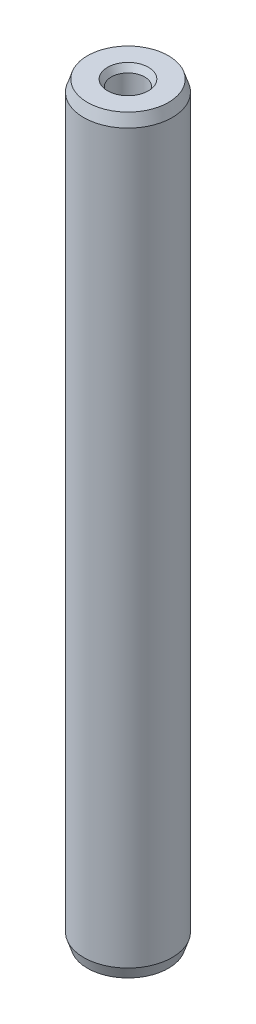
ISO-10303-21;
HEADER;
FILE_DESCRIPTION(('STEP AP214'),'2;1');
FILE_NAME('part.step','',(''),(''),'','','');
FILE_SCHEMA(('AUTOMOTIVE_DESIGN { 1 0 10303 214 1 1 1 1 }'));
ENDSEC;
DATA;
#1=APPLICATION_CONTEXT('core data for automotive mechanical design processes');
#2=APPLICATION_PROTOCOL_DEFINITION('international standard','automotive_design',2000,#1);
#3=PRODUCT_CONTEXT('',#1,'mechanical');
#4=PRODUCT('Part','Part','',(#3));
#5=PRODUCT_RELATED_PRODUCT_CATEGORY('part','',(#4));
#6=PRODUCT_DEFINITION_FORMATION('','',#4);
#7=PRODUCT_DEFINITION_CONTEXT('part definition',#1,'design');
#8=PRODUCT_DEFINITION('design','',#6,#7);
#9=PRODUCT_DEFINITION_SHAPE('','',#8);
#10=(LENGTH_UNIT() NAMED_UNIT(*) SI_UNIT(.MILLI.,.METRE.));
#11=(NAMED_UNIT(*) PLANE_ANGLE_UNIT() SI_UNIT($,.RADIAN.));
#12=(NAMED_UNIT(*) SI_UNIT($,.STERADIAN.) SOLID_ANGLE_UNIT());
#13=UNCERTAINTY_MEASURE_WITH_UNIT(LENGTH_MEASURE(1.E-05),#10,'distance_accuracy_value','');
#14=(GEOMETRIC_REPRESENTATION_CONTEXT(3) GLOBAL_UNCERTAINTY_ASSIGNED_CONTEXT((#13)) GLOBAL_UNIT_ASSIGNED_CONTEXT((#10,
#11,#12)) REPRESENTATION_CONTEXT('',''));
#15=CARTESIAN_POINT('',(0.,0.,0.));
#16=DIRECTION('',(0.,0.,1.));
#17=DIRECTION('',(1.,0.,0.));
#18=AXIS2_PLACEMENT_3D('',#15,#16,#17);
#19=CARTESIAN_POINT('',(-1.0659227422867,-22.9140630693795,-1.12643595849704));
#20=DIRECTION('',(0.,1.,0.));
#21=DIRECTION('',(0.,0.,1.));
#22=AXIS2_PLACEMENT_3D('',#19,#20,#21);
#23=CYLINDRICAL_SURFACE('',#22,1.1303);
#24=CARTESIAN_POINT('',(-1.0659227422867,-17.1990630693591,-1.12643595849704));
#25=DIRECTION('',(0.,1.,0.));
#26=DIRECTION('',(0.,0.,1.));
#27=AXIS2_PLACEMENT_3D('',#24,#25,#26);
#28=CIRCLE('',#27,1.1303);
#29=CARTESIAN_POINT('',(-1.0659227422867,-17.1990630693591,0.00386404150295831));
#30=VERTEX_POINT('',#29);
#31=EDGE_CURVE('E11',#30,#30,#28,.T.);
#32=ORIENTED_EDGE('',*,*,#31,.T.);
#33=EDGE_LOOP('',(#32));
#34=FACE_BOUND('',#33,.T.);
#35=CARTESIAN_POINT('',(-1.0659227422867,-22.4741221642265,-1.12643595849704));
#36=DIRECTION('',(0.,1.,0.));
#37=DIRECTION('',(0.,0.,1.));
#38=AXIS2_PLACEMENT_3D('',#35,#36,#37);
#39=CIRCLE('',#38,1.1303);
#40=CARTESIAN_POINT('',(-1.0659227422867,-22.4741221642265,0.00386404150295831));
#41=VERTEX_POINT('',#40);
#42=EDGE_CURVE('E57',#41,#41,#39,.T.);
#43=ORIENTED_EDGE('',*,*,#42,.F.);
#44=EDGE_LOOP('',(#43));
#45=FACE_BOUND('',#44,.T.);
#46=ADVANCED_FACE('F34',(#34,#45),#23,.F.);
#47=CARTESIAN_POINT('',(-1.0659227422867,-17.1990630693591,-1.12643595849704));
#48=DIRECTION('',(0.,-1.,0.));
#49=DIRECTION('',(0.,0.,-1.));
#50=AXIS2_PLACEMENT_3D('',#47,#48,#49);
#51=CONICAL_SURFACE('',#50,1.1303,1.02974425853617);
#52=CARTESIAN_POINT('',(-1.0659227422867,-16.5199103114562,-1.12643595849704));
#53=VERTEX_POINT('',#52);
#54=VERTEX_LOOP('',#53);
#55=FACE_BOUND('',#54,.T.);
#56=ORIENTED_EDGE('',*,*,#31,.F.);
#57=EDGE_LOOP('',(#56));
#58=FACE_BOUND('',#57,.T.);
#59=ADVANCED_FACE('F47',(#55,#58),#51,.F.);
#60=CARTESIAN_POINT('',(-1.0659227422867,21.4917841728488,-1.12643595849704));
#61=DIRECTION('',(0.,1.,0.));
#62=DIRECTION('',(0.,0.,1.));
#63=AXIS2_PLACEMENT_3D('',#60,#61,#62);
#64=CONICAL_SURFACE('',#63,0.,1.02974425855837);
#65=CARTESIAN_POINT('',(-1.0659227422867,22.1709369307176,-1.12643595849704));
#66=DIRECTION('',(0.,1.,0.));
#67=DIRECTION('',(0.,0.,1.));
#68=AXIS2_PLACEMENT_3D('',#65,#66,#67);
#69=CIRCLE('',#68,1.1303);
#70=CARTESIAN_POINT('',(-1.0659227422867,22.1709369307176,0.00386404150295831));
#71=VERTEX_POINT('',#70);
#72=EDGE_CURVE('E41',#71,#71,#69,.T.);
#73=ORIENTED_EDGE('',*,*,#72,.T.);
#74=EDGE_LOOP('',(#73));
#75=FACE_BOUND('',#74,.T.);
#76=CARTESIAN_POINT('',(-1.0659227422867,21.4917841728488,-1.12643595849704));
#77=VERTEX_POINT('',#76);
#78=VERTEX_LOOP('',#77);
#79=FACE_BOUND('',#78,.T.);
#80=ADVANCED_FACE('F50',(#75,#79),#64,.F.);
#81=CARTESIAN_POINT('',(-1.0659227422867,-22.9140630693795,-1.12643595849704));
#82=DIRECTION('',(0.,1.,0.));
#83=DIRECTION('',(0.,0.,1.));
#84=AXIS2_PLACEMENT_3D('',#81,#82,#83);
#85=CYLINDRICAL_SURFACE('',#84,1.1303);
#86=CARTESIAN_POINT('',(-1.0659227422867,27.4459960255054,-1.12643595849704));
#87=DIRECTION('',(0.,1.,0.));
#88=DIRECTION('',(0.,0.,1.));
#89=AXIS2_PLACEMENT_3D('',#86,#87,#88);
#90=CIRCLE('',#89,1.1303);
#91=CARTESIAN_POINT('',(-1.0659227422867,27.4459960255054,0.00386404150295831));
#92=VERTEX_POINT('',#91);
#93=EDGE_CURVE('E79',#92,#92,#90,.T.);
#94=ORIENTED_EDGE('',*,*,#93,.T.);
#95=EDGE_LOOP('',(#94));
#96=FACE_BOUND('',#95,.T.);
#97=ORIENTED_EDGE('',*,*,#72,.F.);
#98=EDGE_LOOP('',(#97));
#99=FACE_BOUND('',#98,.T.);
#100=ADVANCED_FACE('F85',(#96,#99),#85,.F.);
#101=CARTESIAN_POINT('',(-1.0659227422867,27.4459960255054,-1.12643595849704));
#102=DIRECTION('',(0.,1.,0.));
#103=DIRECTION('',(0.,0.,1.));
#104=AXIS2_PLACEMENT_3D('',#101,#102,#103);
#105=CONICAL_SURFACE('',#104,1.1303,0.523598775485724);
#106=CARTESIAN_POINT('',(-1.0659227422867,27.8859369307156,-1.12643595849704));
#107=DIRECTION('',(0.,1.,0.));
#108=DIRECTION('',(0.,0.,1.));
#109=AXIS2_PLACEMENT_3D('',#106,#107,#108);
#110=CIRCLE('',#109,1.38429999998458);
#111=CARTESIAN_POINT('',(-1.0659227422867,27.8859369307156,0.257864041487543));
#112=VERTEX_POINT('',#111);
#113=EDGE_CURVE('E76',#112,#112,#110,.T.);
#114=ORIENTED_EDGE('',*,*,#113,.T.);
#115=EDGE_LOOP('',(#114));
#116=FACE_BOUND('',#115,.T.);
#117=ORIENTED_EDGE('',*,*,#93,.F.);
#118=EDGE_LOOP('',(#117));
#119=FACE_BOUND('',#118,.T.);
#120=ADVANCED_FACE('F87',(#116,#119),#105,.F.);
#121=CARTESIAN_POINT('',(0.318377257697882,27.8859369307156,-1.12643595849704));
#122=DIRECTION('',(0.,1.,0.));
#123=DIRECTION('',(0.,0.,1.));
#124=AXIS2_PLACEMENT_3D('',#121,#122,#123);
#125=PLANE('',#124);
#126=CARTESIAN_POINT('',(-1.0659227422867,27.8859369307156,-1.12643595849704));
#127=DIRECTION('',(0.,1.,0.));
#128=DIRECTION('',(0.,0.,1.));
#129=AXIS2_PLACEMENT_3D('',#126,#127,#128);
#130=CIRCLE('',#129,2.74320000000416);
#131=CARTESIAN_POINT('',(-1.0659227422867,27.8859369307156,1.61676404150712));
#132=VERTEX_POINT('',#131);
#133=EDGE_CURVE('E73',#132,#132,#130,.T.);
#134=ORIENTED_EDGE('',*,*,#133,.T.);
#135=EDGE_LOOP('',(#134));
#136=FACE_BOUND('',#135,.T.);
#137=ORIENTED_EDGE('',*,*,#113,.F.);
#138=EDGE_LOOP('',(#137));
#139=FACE_BOUND('',#138,.T.);
#140=ADVANCED_FACE('F94',(#136,#139),#125,.T.);
#141=CARTESIAN_POINT('',(-1.0659227422867,27.8859369307156,-1.12643595849704));
#142=DIRECTION('',(0.,-1.,0.));
#143=DIRECTION('',(0.,0.,-1.));
#144=AXIS2_PLACEMENT_3D('',#141,#142,#143);
#145=CONICAL_SURFACE('',#144,2.74320000000416,0.321750554414371);
#146=CARTESIAN_POINT('',(-1.0659227422867,27.1239369307251,-1.12643595849704));
#147=DIRECTION('',(0.,1.,0.));
#148=DIRECTION('',(0.,0.,1.));
#149=AXIS2_PLACEMENT_3D('',#146,#147,#148);
#150=CIRCLE('',#149,2.99720000001602);
#151=CARTESIAN_POINT('',(-1.0659227422867,27.1239369307251,1.87076404151898));
#152=VERTEX_POINT('',#151);
#153=EDGE_CURVE('E70',#152,#152,#150,.T.);
#154=ORIENTED_EDGE('',*,*,#153,.T.);
#155=EDGE_LOOP('',(#154));
#156=FACE_BOUND('',#155,.T.);
#157=ORIENTED_EDGE('',*,*,#133,.F.);
#158=EDGE_LOOP('',(#157));
#159=FACE_BOUND('',#158,.T.);
#160=ADVANCED_FACE('F101',(#156,#159),#145,.T.);
#161=CARTESIAN_POINT('',(-1.0659227422867,-22.9140630693795,-1.12643595849704));
#162=DIRECTION('',(0.,1.,0.));
#163=DIRECTION('',(0.,0.,1.));
#164=AXIS2_PLACEMENT_3D('',#161,#162,#163);
#165=CYLINDRICAL_SURFACE('',#164,2.99720000001602);
#166=CARTESIAN_POINT('',(-1.0659227422867,-22.1520630692749,-1.12643595849704));
#167=DIRECTION('',(0.,1.,0.));
#168=DIRECTION('',(0.,0.,1.));
#169=AXIS2_PLACEMENT_3D('',#166,#167,#168);
#170=CIRCLE('',#169,2.99720000001602);
#171=CARTESIAN_POINT('',(-1.0659227422867,-22.1520630692749,1.87076404151898));
#172=VERTEX_POINT('',#171);
#173=EDGE_CURVE('E67',#172,#172,#170,.T.);
#174=ORIENTED_EDGE('',*,*,#173,.T.);
#175=EDGE_LOOP('',(#174));
#176=FACE_BOUND('',#175,.T.);
#177=ORIENTED_EDGE('',*,*,#153,.F.);
#178=EDGE_LOOP('',(#177));
#179=FACE_BOUND('',#178,.T.);
#180=ADVANCED_FACE('F105',(#176,#179),#165,.T.);
#181=CARTESIAN_POINT('',(-1.0659227422867,-22.1520630692749,-1.12643595849704));
#182=DIRECTION('',(0.,1.,0.));
#183=DIRECTION('',(0.,0.,1.));
#184=AXIS2_PLACEMENT_3D('',#181,#182,#183);
#185=CONICAL_SURFACE('',#184,2.99720000001602,0.321750554414373);
#186=CARTESIAN_POINT('',(-1.0659227422867,-22.9140630693223,-1.12643595849704));
#187=DIRECTION('',(0.,1.,0.));
#188=DIRECTION('',(0.,0.,1.));
#189=AXIS2_PLACEMENT_3D('',#186,#187,#188);
#190=CIRCLE('',#189,2.74319999998521);
#191=CARTESIAN_POINT('',(-1.0659227422867,-22.9140630693223,1.61676404148817));
#192=VERTEX_POINT('',#191);
#193=EDGE_CURVE('E62',#192,#192,#190,.T.);
#194=ORIENTED_EDGE('',*,*,#193,.T.);
#195=EDGE_LOOP('',(#194));
#196=FACE_BOUND('',#195,.T.);
#197=ORIENTED_EDGE('',*,*,#173,.F.);
#198=EDGE_LOOP('',(#197));
#199=FACE_BOUND('',#198,.T.);
#200=ADVANCED_FACE('F109',(#196,#199),#185,.T.);
#201=CARTESIAN_POINT('',(1.67727725769851,-22.9140630693223,-1.12643595849704));
#202=DIRECTION('',(0.,-1.,0.));
#203=DIRECTION('',(0.,0.,-1.));
#204=AXIS2_PLACEMENT_3D('',#201,#202,#203);
#205=PLANE('',#204);
#206=CARTESIAN_POINT('',(-1.0659227422867,-22.9140630693223,-1.12643595849704));
#207=DIRECTION('',(0.,1.,0.));
#208=DIRECTION('',(0.,0.,1.));
#209=AXIS2_PLACEMENT_3D('',#206,#207,#208);
#210=CIRCLE('',#209,1.38429999998458);
#211=CARTESIAN_POINT('',(-1.0659227422867,-22.9140630693223,0.257864041487543));
#212=VERTEX_POINT('',#211);
#213=EDGE_CURVE('E59',#212,#212,#210,.T.);
#214=ORIENTED_EDGE('',*,*,#213,.T.);
#215=EDGE_LOOP('',(#214));
#216=FACE_BOUND('',#215,.T.);
#217=ORIENTED_EDGE('',*,*,#193,.F.);
#218=EDGE_LOOP('',(#217));
#219=FACE_BOUND('',#218,.T.);
#220=ADVANCED_FACE('F113',(#216,#219),#205,.T.);
#221=CARTESIAN_POINT('',(-1.0659227422867,-22.9140630693223,-1.12643595849704));
#222=DIRECTION('',(0.,-1.,0.));
#223=DIRECTION('',(0.,0.,-1.));
#224=AXIS2_PLACEMENT_3D('',#221,#222,#223);
#225=CONICAL_SURFACE('',#224,1.38429999998458,0.5235987755983);
#226=ORIENTED_EDGE('',*,*,#42,.T.);
#227=EDGE_LOOP('',(#226));
#228=FACE_BOUND('',#227,.T.);
#229=ORIENTED_EDGE('',*,*,#213,.F.);
#230=EDGE_LOOP('',(#229));
#231=FACE_BOUND('',#230,.T.);
#232=ADVANCED_FACE('F117',(#228,#231),#225,.F.);
#233=CLOSED_SHELL('',(#46,#59,#80,#100,#120,#140,#160,#180,#200,#220,#232));
#234=MANIFOLD_SOLID_BREP('B2',#233);
#235=ADVANCED_BREP_SHAPE_REPRESENTATION('',(#18,#234),#14);
#236=SHAPE_DEFINITION_REPRESENTATION(#9,#235);
ENDSEC;
END-ISO-10303-21;
